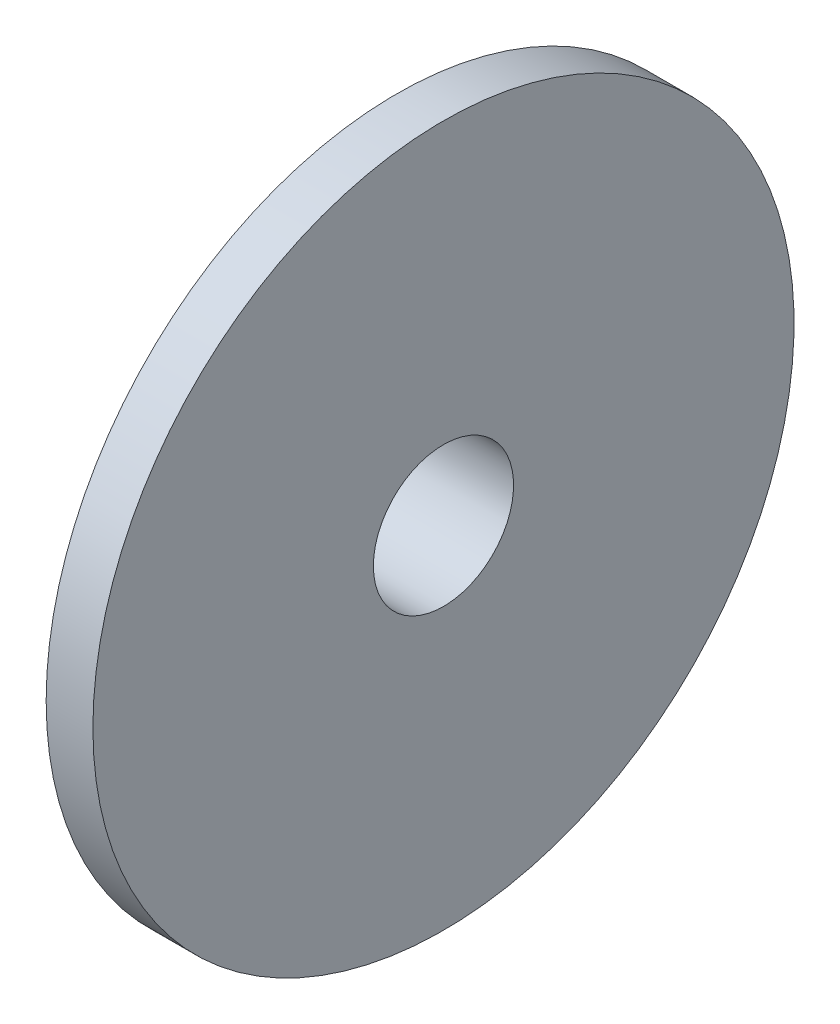
ISO-10303-21;
HEADER;
FILE_DESCRIPTION(('STEP AP214'),'2;1');
FILE_NAME('part.step','',(''),(''),'','','');
FILE_SCHEMA(('AUTOMOTIVE_DESIGN { 1 0 10303 214 1 1 1 1 }'));
ENDSEC;
DATA;
#1=APPLICATION_CONTEXT('core data for automotive mechanical design processes');
#2=APPLICATION_PROTOCOL_DEFINITION('international standard','automotive_design',2000,#1);
#3=PRODUCT_CONTEXT('',#1,'mechanical');
#4=PRODUCT('Part','Part','',(#3));
#5=PRODUCT_RELATED_PRODUCT_CATEGORY('part','',(#4));
#6=PRODUCT_DEFINITION_FORMATION('','',#4);
#7=PRODUCT_DEFINITION_CONTEXT('part definition',#1,'design');
#8=PRODUCT_DEFINITION('design','',#6,#7);
#9=PRODUCT_DEFINITION_SHAPE('','',#8);
#10=(LENGTH_UNIT() NAMED_UNIT(*) SI_UNIT(.MILLI.,.METRE.));
#11=(NAMED_UNIT(*) PLANE_ANGLE_UNIT() SI_UNIT($,.RADIAN.));
#12=(NAMED_UNIT(*) SI_UNIT($,.STERADIAN.) SOLID_ANGLE_UNIT());
#13=UNCERTAINTY_MEASURE_WITH_UNIT(LENGTH_MEASURE(1.E-05),#10,'distance_accuracy_value','');
#14=(GEOMETRIC_REPRESENTATION_CONTEXT(3) GLOBAL_UNCERTAINTY_ASSIGNED_CONTEXT((#13)) GLOBAL_UNIT_ASSIGNED_CONTEXT((#10,
#11,#12)) REPRESENTATION_CONTEXT('',''));
#15=CARTESIAN_POINT('',(0.,0.,0.));
#16=DIRECTION('',(0.,0.,1.));
#17=DIRECTION('',(1.,0.,0.));
#18=AXIS2_PLACEMENT_3D('',#15,#16,#17);
#19=CARTESIAN_POINT('',(-9.09999999999998,0.,0.));
#20=DIRECTION('',(-1.,0.,0.));
#21=DIRECTION('',(0.,0.,1.));
#22=AXIS2_PLACEMENT_3D('',#19,#20,#21);
#23=CYLINDRICAL_SURFACE('',#22,1.5);
#24=CARTESIAN_POINT('',(-3.3,0.,0.));
#25=DIRECTION('',(1.,0.,0.));
#26=DIRECTION('',(0.,0.,-1.));
#27=AXIS2_PLACEMENT_3D('',#24,#25,#26);
#28=CIRCLE('',#27,1.5);
#29=CARTESIAN_POINT('',(-3.3,0.,-1.5));
#30=VERTEX_POINT('',#29);
#31=EDGE_CURVE('E10',#30,#30,#28,.F.);
#32=ORIENTED_EDGE('',*,*,#31,.T.);
#33=EDGE_LOOP('',(#32));
#34=FACE_BOUND('',#33,.T.);
#35=CARTESIAN_POINT('',(0.,0.,0.));
#36=DIRECTION('',(-1.,0.,0.));
#37=DIRECTION('',(0.,0.,1.));
#38=AXIS2_PLACEMENT_3D('',#35,#36,#37);
#39=CIRCLE('',#38,1.5);
#40=CARTESIAN_POINT('',(0.,0.,1.5));
#41=VERTEX_POINT('',#40);
#42=EDGE_CURVE('E52',#41,#41,#39,.T.);
#43=ORIENTED_EDGE('',*,*,#42,.F.);
#44=EDGE_LOOP('',(#43));
#45=FACE_BOUND('',#44,.T.);
#46=ADVANCED_FACE('F32',(#34,#45),#23,.F.);
#47=CARTESIAN_POINT('',(0.,1.5,0.));
#48=DIRECTION('',(-1.,0.,0.));
#49=DIRECTION('',(0.,0.,1.));
#50=AXIS2_PLACEMENT_3D('',#47,#48,#49);
#51=PLANE('',#50);
#52=CARTESIAN_POINT('',(0.,0.,0.));
#53=DIRECTION('',(-1.,0.,0.));
#54=DIRECTION('',(0.,0.,1.));
#55=AXIS2_PLACEMENT_3D('',#52,#53,#54);
#56=CIRCLE('',#55,7.5);
#57=CARTESIAN_POINT('',(0.,0.,7.5));
#58=VERTEX_POINT('',#57);
#59=EDGE_CURVE('E55',#58,#58,#56,.T.);
#60=ORIENTED_EDGE('',*,*,#59,.F.);
#61=EDGE_LOOP('',(#60));
#62=FACE_BOUND('',#61,.T.);
#63=ORIENTED_EDGE('',*,*,#42,.T.);
#64=EDGE_LOOP('',(#63));
#65=FACE_BOUND('',#64,.T.);
#66=ADVANCED_FACE('F76',(#62,#65),#51,.F.);
#67=CARTESIAN_POINT('',(-9.09999999999998,0.,0.));
#68=DIRECTION('',(-1.,0.,0.));
#69=DIRECTION('',(0.,0.,1.));
#70=AXIS2_PLACEMENT_3D('',#67,#68,#69);
#71=CYLINDRICAL_SURFACE('',#70,7.5);
#72=CARTESIAN_POINT('',(-1.,0.,0.));
#73=DIRECTION('',(-1.,0.,0.));
#74=DIRECTION('',(0.,0.,1.));
#75=AXIS2_PLACEMENT_3D('',#72,#73,#74);
#76=CIRCLE('',#75,7.5);
#77=CARTESIAN_POINT('',(-1.,0.,7.5));
#78=VERTEX_POINT('',#77);
#79=EDGE_CURVE('E58',#78,#78,#76,.T.);
#80=ORIENTED_EDGE('',*,*,#79,.F.);
#81=EDGE_LOOP('',(#80));
#82=FACE_BOUND('',#81,.T.);
#83=ORIENTED_EDGE('',*,*,#59,.T.);
#84=EDGE_LOOP('',(#83));
#85=FACE_BOUND('',#84,.T.);
#86=ADVANCED_FACE('F70',(#82,#85),#71,.T.);
#87=CARTESIAN_POINT('',(-1.,7.5,0.));
#88=DIRECTION('',(1.,0.,0.));
#89=DIRECTION('',(0.,0.,-1.));
#90=AXIS2_PLACEMENT_3D('',#87,#88,#89);
#91=PLANE('',#90);
#92=CARTESIAN_POINT('',(-0.999999999999999,0.,0.));
#93=DIRECTION('',(-1.,0.,0.));
#94=DIRECTION('',(0.,0.,1.));
#95=AXIS2_PLACEMENT_3D('',#92,#93,#94);
#96=CIRCLE('',#95,2.75);
#97=CARTESIAN_POINT('',(-0.999999999999999,0.,2.75));
#98=VERTEX_POINT('',#97);
#99=EDGE_CURVE('E61',#98,#98,#96,.T.);
#100=ORIENTED_EDGE('',*,*,#99,.F.);
#101=EDGE_LOOP('',(#100));
#102=FACE_BOUND('',#101,.T.);
#103=ORIENTED_EDGE('',*,*,#79,.T.);
#104=EDGE_LOOP('',(#103));
#105=FACE_BOUND('',#104,.T.);
#106=ADVANCED_FACE('F67',(#102,#105),#91,.F.);
#107=CARTESIAN_POINT('',(-9.09999999999998,0.,0.));
#108=DIRECTION('',(-1.,0.,0.));
#109=DIRECTION('',(0.,0.,1.));
#110=AXIS2_PLACEMENT_3D('',#107,#108,#109);
#111=CYLINDRICAL_SURFACE('',#110,2.75);
#112=CARTESIAN_POINT('',(-3.3,0.,0.));
#113=DIRECTION('',(1.,0.,0.));
#114=DIRECTION('',(0.,0.,-1.));
#115=AXIS2_PLACEMENT_3D('',#112,#113,#114);
#116=CIRCLE('',#115,2.75);
#117=CARTESIAN_POINT('',(-3.3,0.,-2.75));
#118=VERTEX_POINT('',#117);
#119=EDGE_CURVE('E39',#118,#118,#116,.T.);
#120=ORIENTED_EDGE('',*,*,#119,.T.);
#121=EDGE_LOOP('',(#120));
#122=FACE_BOUND('',#121,.T.);
#123=ORIENTED_EDGE('',*,*,#99,.T.);
#124=EDGE_LOOP('',(#123));
#125=FACE_BOUND('',#124,.T.);
#126=ADVANCED_FACE('F65',(#122,#125),#111,.T.);
#127=CARTESIAN_POINT('',(-3.5,2.75,0.));
#128=DIRECTION('',(1.,0.,0.));
#129=DIRECTION('',(0.,0.,-1.));
#130=AXIS2_PLACEMENT_3D('',#127,#128,#129);
#131=PLANE('',#130);
#132=CARTESIAN_POINT('',(-3.5,0.,0.));
#133=DIRECTION('',(1.,0.,0.));
#134=DIRECTION('',(0.,0.,-1.));
#135=AXIS2_PLACEMENT_3D('',#132,#133,#134);
#136=CIRCLE('',#135,2.55);
#137=CARTESIAN_POINT('',(-3.5,0.,-2.55));
#138=VERTEX_POINT('',#137);
#139=EDGE_CURVE('E43',#138,#138,#136,.F.);
#140=ORIENTED_EDGE('',*,*,#139,.T.);
#141=EDGE_LOOP('',(#140));
#142=FACE_BOUND('',#141,.T.);
#143=CARTESIAN_POINT('',(-3.5,0.,0.));
#144=DIRECTION('',(1.,0.,0.));
#145=DIRECTION('',(0.,0.,-1.));
#146=AXIS2_PLACEMENT_3D('',#143,#144,#145);
#147=CIRCLE('',#146,1.7);
#148=CARTESIAN_POINT('',(-3.5,0.,-1.7));
#149=VERTEX_POINT('',#148);
#150=EDGE_CURVE('E47',#149,#149,#147,.T.);
#151=ORIENTED_EDGE('',*,*,#150,.T.);
#152=EDGE_LOOP('',(#151));
#153=FACE_BOUND('',#152,.T.);
#154=ADVANCED_FACE('F91',(#142,#153),#131,.F.);
#155=CARTESIAN_POINT('',(-3.5,0.,0.));
#156=DIRECTION('',(1.,0.,0.));
#157=DIRECTION('',(0.,0.,-1.));
#158=AXIS2_PLACEMENT_3D('',#155,#156,#157);
#159=CONICAL_SURFACE('',#158,2.55,0.785398163397446);
#160=ORIENTED_EDGE('',*,*,#119,.F.);
#161=EDGE_LOOP('',(#160));
#162=FACE_BOUND('',#161,.T.);
#163=ORIENTED_EDGE('',*,*,#139,.F.);
#164=EDGE_LOOP('',(#163));
#165=FACE_BOUND('',#164,.T.);
#166=ADVANCED_FACE('F89',(#162,#165),#159,.T.);
#167=CARTESIAN_POINT('',(-3.3,0.,0.));
#168=DIRECTION('',(-1.,0.,0.));
#169=DIRECTION('',(0.,0.,1.));
#170=AXIS2_PLACEMENT_3D('',#167,#168,#169);
#171=CONICAL_SURFACE('',#170,1.5,0.785398163397454);
#172=ORIENTED_EDGE('',*,*,#150,.F.);
#173=EDGE_LOOP('',(#172));
#174=FACE_BOUND('',#173,.T.);
#175=ORIENTED_EDGE('',*,*,#31,.F.);
#176=EDGE_LOOP('',(#175));
#177=FACE_BOUND('',#176,.T.);
#178=ADVANCED_FACE('F34',(#174,#177),#171,.F.);
#179=CLOSED_SHELL('',(#46,#66,#86,#106,#126,#154,#166,#178));
#180=MANIFOLD_SOLID_BREP('B2',#179);
#181=ADVANCED_BREP_SHAPE_REPRESENTATION('',(#18,#180),#14);
#182=SHAPE_DEFINITION_REPRESENTATION(#9,#181);
ENDSEC;
END-ISO-10303-21;
